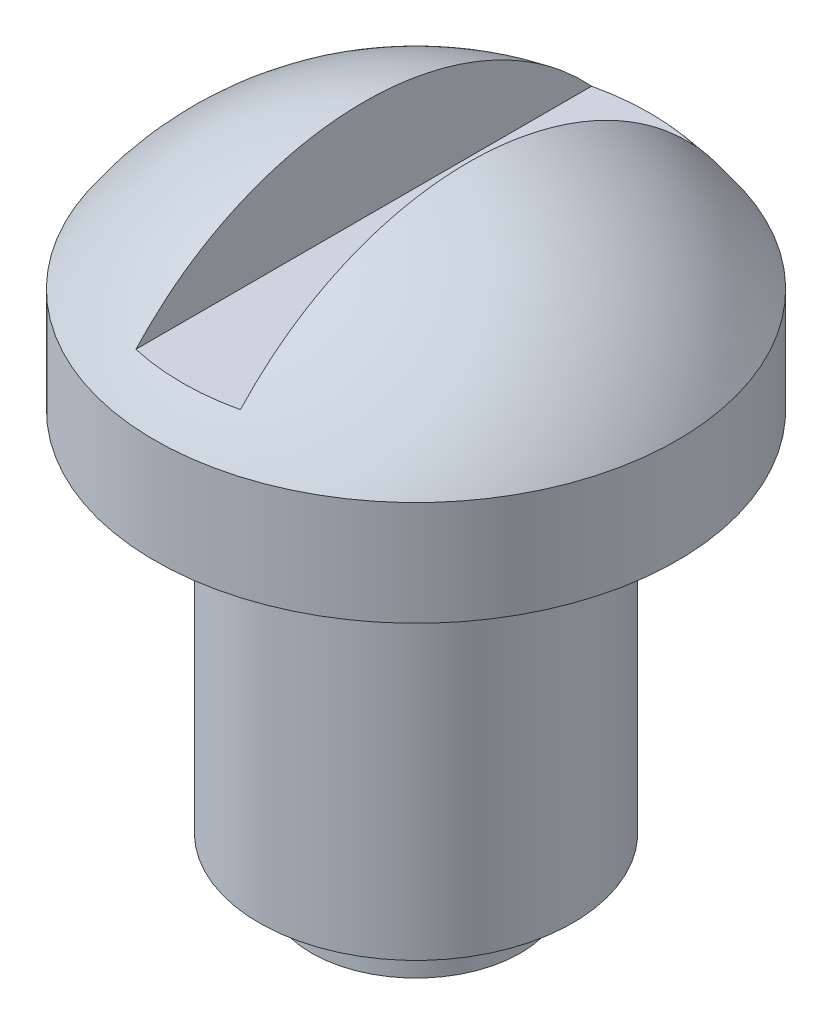
ISO-10303-21;
HEADER;
FILE_DESCRIPTION(('STEP AP214'),'2;1');
FILE_NAME('part.step','',(''),(''),'','','');
FILE_SCHEMA(('AUTOMOTIVE_DESIGN { 1 0 10303 214 1 1 1 1 }'));
ENDSEC;
DATA;
#1=APPLICATION_CONTEXT('core data for automotive mechanical design processes');
#2=APPLICATION_PROTOCOL_DEFINITION('international standard','automotive_design',2000,#1);
#3=PRODUCT_CONTEXT('',#1,'mechanical');
#4=PRODUCT('Part','Part','',(#3));
#5=PRODUCT_RELATED_PRODUCT_CATEGORY('part','',(#4));
#6=PRODUCT_DEFINITION_FORMATION('','',#4);
#7=PRODUCT_DEFINITION_CONTEXT('part definition',#1,'design');
#8=PRODUCT_DEFINITION('design','',#6,#7);
#9=PRODUCT_DEFINITION_SHAPE('','',#8);
#10=(LENGTH_UNIT() NAMED_UNIT(*) SI_UNIT(.MILLI.,.METRE.));
#11=(NAMED_UNIT(*) PLANE_ANGLE_UNIT() SI_UNIT($,.RADIAN.));
#12=(NAMED_UNIT(*) SI_UNIT($,.STERADIAN.) SOLID_ANGLE_UNIT());
#13=UNCERTAINTY_MEASURE_WITH_UNIT(LENGTH_MEASURE(1.E-05),#10,'distance_accuracy_value','');
#14=(GEOMETRIC_REPRESENTATION_CONTEXT(3) GLOBAL_UNCERTAINTY_ASSIGNED_CONTEXT((#13)) GLOBAL_UNIT_ASSIGNED_CONTEXT((#10,
#11,#12)) REPRESENTATION_CONTEXT('',''));
#15=CARTESIAN_POINT('',(0.,0.,0.));
#16=DIRECTION('',(0.,0.,1.));
#17=DIRECTION('',(1.,0.,0.));
#18=AXIS2_PLACEMENT_3D('',#15,#16,#17);
#19=CARTESIAN_POINT('',(0.,-6.,0.));
#20=DIRECTION('',(0.,1.,0.));
#21=DIRECTION('',(1.,0.,0.));
#22=AXIS2_PLACEMENT_3D('',#19,#20,#21);
#23=SPHERICAL_SURFACE('',#22,6.);
#24=CARTESIAN_POINT('',(0.,-2.,0.));
#25=DIRECTION('',(0.,-1.,0.));
#26=DIRECTION('',(0.,0.,-1.));
#27=AXIS2_PLACEMENT_3D('',#24,#25,#26);
#28=CIRCLE('',#27,4.47213595499958);
#29=CARTESIAN_POINT('',(-1.,-2.,-4.35889894354067));
#30=VERTEX_POINT('',#29);
#31=CARTESIAN_POINT('',(1.,-2.,-4.35889894354067));
#32=VERTEX_POINT('',#31);
#33=EDGE_CURVE('E67',#30,#32,#28,.T.);
#34=ORIENTED_EDGE('',*,*,#33,.T.);
#35=CARTESIAN_POINT('',(1.,-6.,0.));
#36=DIRECTION('',(1.,0.,0.));
#37=DIRECTION('',(0.,0.,-1.));
#38=AXIS2_PLACEMENT_3D('',#35,#36,#37);
#39=CIRCLE('',#38,5.91607978309962);
#40=CARTESIAN_POINT('',(1.,-2.,4.35889894354067));
#41=VERTEX_POINT('',#40);
#42=EDGE_CURVE('E11',#32,#41,#39,.T.);
#43=ORIENTED_EDGE('',*,*,#42,.T.);
#44=CARTESIAN_POINT('',(-1.,-2.,4.35889894354067));
#45=VERTEX_POINT('',#44);
#46=EDGE_CURVE('E44',#41,#45,#28,.T.);
#47=ORIENTED_EDGE('',*,*,#46,.T.);
#48=CARTESIAN_POINT('',(-1.,-6.,0.));
#49=DIRECTION('',(-1.,0.,0.));
#50=DIRECTION('',(0.,-1.,0.));
#51=AXIS2_PLACEMENT_3D('',#48,#49,#50);
#52=CIRCLE('',#51,5.91607978309962);
#53=EDGE_CURVE('E63',#45,#30,#52,.T.);
#54=ORIENTED_EDGE('',*,*,#53,.T.);
#55=EDGE_LOOP('',(#34,#43,#47,#54));
#56=FACE_BOUND('',#55,.T.);
#57=CARTESIAN_POINT('',(0.,-2.6833752096446,0.));
#58=DIRECTION('',(0.,1.,0.));
#59=DIRECTION('',(-1.,0.,0.));
#60=AXIS2_PLACEMENT_3D('',#57,#58,#59);
#61=CIRCLE('',#60,5.);
#62=CARTESIAN_POINT('',(-5.,-2.6833752096446,0.));
#63=VERTEX_POINT('',#62);
#64=EDGE_CURVE('E68',#63,#63,#61,.T.);
#65=ORIENTED_EDGE('',*,*,#64,.T.);
#66=EDGE_LOOP('',(#65));
#67=FACE_BOUND('',#66,.T.);
#68=ADVANCED_FACE('F37',(#56,#67),#23,.T.);
#69=CARTESIAN_POINT('',(0.,0.,0.));
#70=DIRECTION('',(0.,1.,0.));
#71=DIRECTION('',(-1.,0.,0.));
#72=AXIS2_PLACEMENT_3D('',#69,#70,#71);
#73=CYLINDRICAL_SURFACE('',#72,5.);
#74=ORIENTED_EDGE('',*,*,#64,.F.);
#75=EDGE_LOOP('',(#74));
#76=FACE_BOUND('',#75,.T.);
#77=CARTESIAN_POINT('',(0.,-4.6833752096446,0.));
#78=DIRECTION('',(0.,1.,0.));
#79=DIRECTION('',(-1.,0.,0.));
#80=AXIS2_PLACEMENT_3D('',#77,#78,#79);
#81=CIRCLE('',#80,5.);
#82=CARTESIAN_POINT('',(-5.,-4.6833752096446,0.));
#83=VERTEX_POINT('',#82);
#84=EDGE_CURVE('E77',#83,#83,#81,.T.);
#85=ORIENTED_EDGE('',*,*,#84,.T.);
#86=EDGE_LOOP('',(#85));
#87=FACE_BOUND('',#86,.T.);
#88=ADVANCED_FACE('F107',(#76,#87),#73,.T.);
#89=CARTESIAN_POINT('',(3.,-4.6833752096446,0.));
#90=DIRECTION('',(0.,1.,0.));
#91=DIRECTION('',(-1.,0.,0.));
#92=AXIS2_PLACEMENT_3D('',#89,#90,#91);
#93=PLANE('',#92);
#94=ORIENTED_EDGE('',*,*,#84,.F.);
#95=EDGE_LOOP('',(#94));
#96=FACE_BOUND('',#95,.T.);
#97=CARTESIAN_POINT('',(0.,-4.6833752096446,0.));
#98=DIRECTION('',(0.,1.,0.));
#99=DIRECTION('',(-1.,0.,0.));
#100=AXIS2_PLACEMENT_3D('',#97,#98,#99);
#101=CIRCLE('',#100,3.);
#102=CARTESIAN_POINT('',(-3.,-4.6833752096446,0.));
#103=VERTEX_POINT('',#102);
#104=EDGE_CURVE('E80',#103,#103,#101,.T.);
#105=ORIENTED_EDGE('',*,*,#104,.T.);
#106=EDGE_LOOP('',(#105));
#107=FACE_BOUND('',#106,.T.);
#108=ADVANCED_FACE('F111',(#96,#107),#93,.F.);
#109=CARTESIAN_POINT('',(0.,0.,0.));
#110=DIRECTION('',(0.,1.,0.));
#111=DIRECTION('',(-1.,0.,0.));
#112=AXIS2_PLACEMENT_3D('',#109,#110,#111);
#113=CYLINDRICAL_SURFACE('',#112,3.);
#114=ORIENTED_EDGE('',*,*,#104,.F.);
#115=EDGE_LOOP('',(#114));
#116=FACE_BOUND('',#115,.T.);
#117=CARTESIAN_POINT('',(0.,-11.6833752096446,0.));
#118=DIRECTION('',(0.,1.,0.));
#119=DIRECTION('',(-1.,0.,0.));
#120=AXIS2_PLACEMENT_3D('',#117,#118,#119);
#121=CIRCLE('',#120,3.);
#122=CARTESIAN_POINT('',(-3.,-11.6833752096446,0.));
#123=VERTEX_POINT('',#122);
#124=EDGE_CURVE('E83',#123,#123,#121,.T.);
#125=ORIENTED_EDGE('',*,*,#124,.T.);
#126=EDGE_LOOP('',(#125));
#127=FACE_BOUND('',#126,.T.);
#128=ADVANCED_FACE('F116',(#116,#127),#113,.T.);
#129=CARTESIAN_POINT('',(2.,-11.6833752096446,0.));
#130=DIRECTION('',(0.,1.,0.));
#131=DIRECTION('',(-1.,0.,0.));
#132=AXIS2_PLACEMENT_3D('',#129,#130,#131);
#133=PLANE('',#132);
#134=ORIENTED_EDGE('',*,*,#124,.F.);
#135=EDGE_LOOP('',(#134));
#136=FACE_BOUND('',#135,.T.);
#137=CARTESIAN_POINT('',(0.,-11.6833752096446,0.));
#138=DIRECTION('',(0.,1.,0.));
#139=DIRECTION('',(-1.,0.,0.));
#140=AXIS2_PLACEMENT_3D('',#137,#138,#139);
#141=CIRCLE('',#140,2.);
#142=CARTESIAN_POINT('',(-2.,-11.6833752096446,0.));
#143=VERTEX_POINT('',#142);
#144=EDGE_CURVE('E86',#143,#143,#141,.T.);
#145=ORIENTED_EDGE('',*,*,#144,.T.);
#146=EDGE_LOOP('',(#145));
#147=FACE_BOUND('',#146,.T.);
#148=ADVANCED_FACE('F124',(#136,#147),#133,.F.);
#149=CARTESIAN_POINT('',(0.,0.,0.));
#150=DIRECTION('',(0.,1.,0.));
#151=DIRECTION('',(-1.,0.,0.));
#152=AXIS2_PLACEMENT_3D('',#149,#150,#151);
#153=CYLINDRICAL_SURFACE('',#152,2.);
#154=ORIENTED_EDGE('',*,*,#144,.F.);
#155=EDGE_LOOP('',(#154));
#156=FACE_BOUND('',#155,.T.);
#157=CARTESIAN_POINT('',(0.,-12.6833752096446,0.));
#158=DIRECTION('',(0.,1.,0.));
#159=DIRECTION('',(-1.,0.,0.));
#160=AXIS2_PLACEMENT_3D('',#157,#158,#159);
#161=CIRCLE('',#160,2.);
#162=CARTESIAN_POINT('',(-2.,-12.6833752096446,0.));
#163=VERTEX_POINT('',#162);
#164=EDGE_CURVE('E89',#163,#163,#161,.T.);
#165=ORIENTED_EDGE('',*,*,#164,.T.);
#166=EDGE_LOOP('',(#165));
#167=FACE_BOUND('',#166,.T.);
#168=ADVANCED_FACE('F102',(#156,#167),#153,.T.);
#169=CARTESIAN_POINT('',(0.,-12.6833752096446,0.));
#170=DIRECTION('',(0.,1.,0.));
#171=DIRECTION('',(-1.,0.,0.));
#172=AXIS2_PLACEMENT_3D('',#169,#170,#171);
#173=PLANE('',#172);
#174=ORIENTED_EDGE('',*,*,#164,.F.);
#175=EDGE_LOOP('',(#174));
#176=FACE_BOUND('',#175,.T.);
#177=ADVANCED_FACE('F95',(#176),#173,.F.);
#178=CARTESIAN_POINT('',(1.,2.,-5.));
#179=DIRECTION('',(1.,0.,0.));
#180=DIRECTION('',(0.,0.,-1.));
#181=AXIS2_PLACEMENT_3D('',#178,#179,#180);
#182=PLANE('',#181);
#183=DIRECTION('',(0.,0.,1.));
#184=VECTOR('',#183,1.);
#185=CARTESIAN_POINT('',(1.,-2.,-5.));
#186=LINE('',#185,#184);
#187=EDGE_CURVE('E71',#32,#41,#186,.T.);
#188=ORIENTED_EDGE('',*,*,#187,.T.);
#189=ORIENTED_EDGE('',*,*,#42,.F.);
#190=EDGE_LOOP('',(#188,#189));
#191=FACE_BOUND('',#190,.T.);
#192=ADVANCED_FACE('F93',(#191),#182,.F.);
#193=CARTESIAN_POINT('',(-1.,-2.,-5.));
#194=DIRECTION('',(0.,-1.,0.));
#195=DIRECTION('',(0.,0.,-1.));
#196=AXIS2_PLACEMENT_3D('',#193,#194,#195);
#197=PLANE('',#196);
#198=ORIENTED_EDGE('',*,*,#187,.F.);
#199=ORIENTED_EDGE('',*,*,#33,.F.);
#200=DIRECTION('',(0.,0.,1.));
#201=VECTOR('',#200,1.);
#202=CARTESIAN_POINT('',(-1.,-2.,-5.));
#203=LINE('',#202,#201);
#204=EDGE_CURVE('E50',#30,#45,#203,.T.);
#205=ORIENTED_EDGE('',*,*,#204,.T.);
#206=ORIENTED_EDGE('',*,*,#46,.F.);
#207=EDGE_LOOP('',(#198,#199,#205,#206));
#208=FACE_BOUND('',#207,.T.);
#209=ADVANCED_FACE('F70',(#208),#197,.F.);
#210=CARTESIAN_POINT('',(-0.999999999999999,2.,-5.));
#211=DIRECTION('',(-1.,0.,0.));
#212=DIRECTION('',(0.,-1.,0.));
#213=AXIS2_PLACEMENT_3D('',#210,#211,#212);
#214=PLANE('',#213);
#215=ORIENTED_EDGE('',*,*,#204,.F.);
#216=ORIENTED_EDGE('',*,*,#53,.F.);
#217=EDGE_LOOP('',(#215,#216));
#218=FACE_BOUND('',#217,.T.);
#219=ADVANCED_FACE('F64',(#218),#214,.F.);
#220=CLOSED_SHELL('',(#68,#88,#108,#128,#148,#168,#177,#192,#209,#219));
#221=MANIFOLD_SOLID_BREP('B2',#220);
#222=ADVANCED_BREP_SHAPE_REPRESENTATION('',(#18,#221),#14);
#223=SHAPE_DEFINITION_REPRESENTATION(#9,#222);
ENDSEC;
END-ISO-10303-21;
